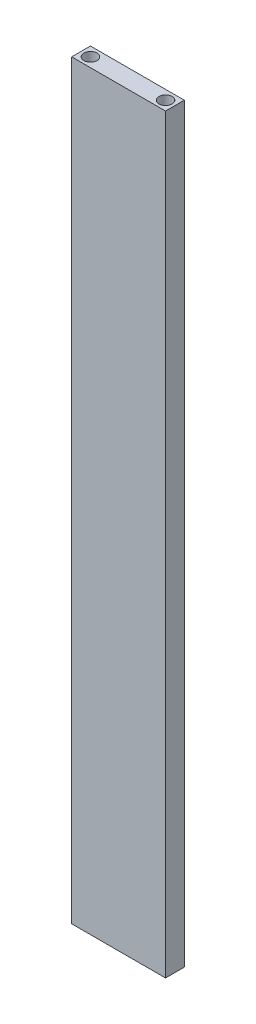
ISO-10303-21;
HEADER;
FILE_DESCRIPTION(('STEP AP214'),'2;1');
FILE_NAME('part.step','',(''),(''),'','','');
FILE_SCHEMA(('AUTOMOTIVE_DESIGN { 1 0 10303 214 1 1 1 1 }'));
ENDSEC;
DATA;
#1=APPLICATION_CONTEXT('core data for automotive mechanical design processes');
#2=APPLICATION_PROTOCOL_DEFINITION('international standard','automotive_design',2000,#1);
#3=PRODUCT_CONTEXT('',#1,'mechanical');
#4=PRODUCT('Part','Part','',(#3));
#5=PRODUCT_RELATED_PRODUCT_CATEGORY('part','',(#4));
#6=PRODUCT_DEFINITION_FORMATION('','',#4);
#7=PRODUCT_DEFINITION_CONTEXT('part definition',#1,'design');
#8=PRODUCT_DEFINITION('design','',#6,#7);
#9=PRODUCT_DEFINITION_SHAPE('','',#8);
#10=(LENGTH_UNIT() NAMED_UNIT(*) SI_UNIT(.MILLI.,.METRE.));
#11=(NAMED_UNIT(*) PLANE_ANGLE_UNIT() SI_UNIT($,.RADIAN.));
#12=(NAMED_UNIT(*) SI_UNIT($,.STERADIAN.) SOLID_ANGLE_UNIT());
#13=UNCERTAINTY_MEASURE_WITH_UNIT(LENGTH_MEASURE(1.E-05),#10,'distance_accuracy_value','');
#14=(GEOMETRIC_REPRESENTATION_CONTEXT(3) GLOBAL_UNCERTAINTY_ASSIGNED_CONTEXT((#13)) GLOBAL_UNIT_ASSIGNED_CONTEXT((#10,
#11,#12)) REPRESENTATION_CONTEXT('',''));
#15=CARTESIAN_POINT('',(0.,0.,0.));
#16=DIRECTION('',(0.,0.,1.));
#17=DIRECTION('',(1.,0.,0.));
#18=AXIS2_PLACEMENT_3D('',#15,#16,#17);
#19=CARTESIAN_POINT('',(0.,160.,0.));
#20=DIRECTION('',(-1.,0.,0.));
#21=DIRECTION('',(0.,0.,1.));
#22=AXIS2_PLACEMENT_3D('',#19,#20,#21);
#23=PLANE('',#22);
#24=DIRECTION('',(0.,0.,-1.));
#25=VECTOR('',#24,1.);
#26=CARTESIAN_POINT('',(0.,0.,0.));
#27=LINE('',#26,#25);
#28=CARTESIAN_POINT('',(0.,0.,4.));
#29=VERTEX_POINT('',#28);
#30=CARTESIAN_POINT('',(0.,0.,0.));
#31=VERTEX_POINT('',#30);
#32=EDGE_CURVE('E96',#29,#31,#27,.T.);
#33=ORIENTED_EDGE('',*,*,#32,.T.);
#34=DIRECTION('',(0.,-1.,0.));
#35=VECTOR('',#34,1.);
#36=CARTESIAN_POINT('',(0.,160.,0.));
#37=LINE('',#36,#35);
#38=CARTESIAN_POINT('',(0.,160.,0.));
#39=VERTEX_POINT('',#38);
#40=EDGE_CURVE('E11',#39,#31,#37,.T.);
#41=ORIENTED_EDGE('',*,*,#40,.F.);
#42=DIRECTION('',(0.,0.,-1.));
#43=VECTOR('',#42,1.);
#44=CARTESIAN_POINT('',(0.,160.,0.));
#45=LINE('',#44,#43);
#46=CARTESIAN_POINT('',(0.,160.,4.));
#47=VERTEX_POINT('',#46);
#48=EDGE_CURVE('E84',#47,#39,#45,.T.);
#49=ORIENTED_EDGE('',*,*,#48,.F.);
#50=DIRECTION('',(0.,-1.,0.));
#51=VECTOR('',#50,1.);
#52=CARTESIAN_POINT('',(0.,160.,4.));
#53=LINE('',#52,#51);
#54=EDGE_CURVE('E92',#47,#29,#53,.T.);
#55=ORIENTED_EDGE('',*,*,#54,.T.);
#56=EDGE_LOOP('',(#33,#41,#49,#55));
#57=FACE_BOUND('',#56,.T.);
#58=ADVANCED_FACE('F33',(#57),#23,.F.);
#59=CARTESIAN_POINT('',(0.,160.,0.));
#60=DIRECTION('',(0.,0.,1.));
#61=DIRECTION('',(1.,0.,0.));
#62=AXIS2_PLACEMENT_3D('',#59,#60,#61);
#63=PLANE('',#62);
#64=DIRECTION('',(-1.,0.,0.));
#65=VECTOR('',#64,1.);
#66=CARTESIAN_POINT('',(0.,0.,0.));
#67=LINE('',#66,#65);
#68=CARTESIAN_POINT('',(-20.,0.,0.));
#69=VERTEX_POINT('',#68);
#70=EDGE_CURVE('E88',#31,#69,#67,.T.);
#71=ORIENTED_EDGE('',*,*,#70,.T.);
#72=DIRECTION('',(0.,-1.,0.));
#73=VECTOR('',#72,1.);
#74=CARTESIAN_POINT('',(-20.,160.,0.));
#75=LINE('',#74,#73);
#76=CARTESIAN_POINT('',(-20.,160.,0.));
#77=VERTEX_POINT('',#76);
#78=EDGE_CURVE('E41',#77,#69,#75,.T.);
#79=ORIENTED_EDGE('',*,*,#78,.F.);
#80=DIRECTION('',(-1.,0.,0.));
#81=VECTOR('',#80,1.);
#82=CARTESIAN_POINT('',(0.,160.,0.));
#83=LINE('',#82,#81);
#84=EDGE_CURVE('E79',#39,#77,#83,.T.);
#85=ORIENTED_EDGE('',*,*,#84,.F.);
#86=ORIENTED_EDGE('',*,*,#40,.T.);
#87=EDGE_LOOP('',(#71,#79,#85,#86));
#88=FACE_BOUND('',#87,.T.);
#89=ADVANCED_FACE('F87',(#88),#63,.F.);
#90=CARTESIAN_POINT('',(-20.,160.,0.));
#91=DIRECTION('',(1.,0.,0.));
#92=DIRECTION('',(0.,0.,-1.));
#93=AXIS2_PLACEMENT_3D('',#90,#91,#92);
#94=PLANE('',#93);
#95=DIRECTION('',(0.,0.,1.));
#96=VECTOR('',#95,1.);
#97=CARTESIAN_POINT('',(-20.,0.,0.));
#98=LINE('',#97,#96);
#99=CARTESIAN_POINT('',(-20.,0.,4.));
#100=VERTEX_POINT('',#99);
#101=EDGE_CURVE('E66',#69,#100,#98,.T.);
#102=ORIENTED_EDGE('',*,*,#101,.T.);
#103=DIRECTION('',(0.,-1.,0.));
#104=VECTOR('',#103,1.);
#105=CARTESIAN_POINT('',(-20.,160.,4.));
#106=LINE('',#105,#104);
#107=CARTESIAN_POINT('',(-20.,160.,4.));
#108=VERTEX_POINT('',#107);
#109=EDGE_CURVE('E89',#108,#100,#106,.T.);
#110=ORIENTED_EDGE('',*,*,#109,.F.);
#111=DIRECTION('',(0.,0.,1.));
#112=VECTOR('',#111,1.);
#113=CARTESIAN_POINT('',(-20.,160.,0.));
#114=LINE('',#113,#112);
#115=EDGE_CURVE('E82',#77,#108,#114,.T.);
#116=ORIENTED_EDGE('',*,*,#115,.F.);
#117=ORIENTED_EDGE('',*,*,#78,.T.);
#118=EDGE_LOOP('',(#102,#110,#116,#117));
#119=FACE_BOUND('',#118,.T.);
#120=ADVANCED_FACE('F90',(#119),#94,.F.);
#121=CARTESIAN_POINT('',(0.,160.,4.));
#122=DIRECTION('',(0.,0.,-1.));
#123=DIRECTION('',(-1.,0.,0.));
#124=AXIS2_PLACEMENT_3D('',#121,#122,#123);
#125=PLANE('',#124);
#126=DIRECTION('',(1.,0.,0.));
#127=VECTOR('',#126,1.);
#128=CARTESIAN_POINT('',(0.,0.,4.));
#129=LINE('',#128,#127);
#130=EDGE_CURVE('E72',#100,#29,#129,.T.);
#131=ORIENTED_EDGE('',*,*,#130,.T.);
#132=ORIENTED_EDGE('',*,*,#54,.F.);
#133=DIRECTION('',(1.,0.,0.));
#134=VECTOR('',#133,1.);
#135=CARTESIAN_POINT('',(0.,160.,4.));
#136=LINE('',#135,#134);
#137=EDGE_CURVE('E49',#108,#47,#136,.T.);
#138=ORIENTED_EDGE('',*,*,#137,.F.);
#139=ORIENTED_EDGE('',*,*,#109,.T.);
#140=EDGE_LOOP('',(#131,#132,#138,#139));
#141=FACE_BOUND('',#140,.T.);
#142=ADVANCED_FACE('F104',(#141),#125,.F.);
#143=CARTESIAN_POINT('',(0.,160.,0.));
#144=DIRECTION('',(0.,-1.,0.));
#145=DIRECTION('',(0.,0.,-1.));
#146=AXIS2_PLACEMENT_3D('',#143,#144,#145);
#147=PLANE('',#146);
#148=CARTESIAN_POINT('',(-18.,160.,2.));
#149=DIRECTION('',(0.,-1.,0.));
#150=DIRECTION('',(0.,0.,-1.));
#151=AXIS2_PLACEMENT_3D('',#148,#149,#150);
#152=CIRCLE('',#151,1.4);
#153=CARTESIAN_POINT('',(-18.,160.,0.600000000000001));
#154=VERTEX_POINT('',#153);
#155=EDGE_CURVE('E99',#154,#154,#152,.F.);
#156=ORIENTED_EDGE('',*,*,#155,.F.);
#157=EDGE_LOOP('',(#156));
#158=FACE_BOUND('',#157,.T.);
#159=CARTESIAN_POINT('',(-2.,160.,2.));
#160=DIRECTION('',(0.,-1.,0.));
#161=DIRECTION('',(0.,0.,-1.));
#162=AXIS2_PLACEMENT_3D('',#159,#160,#161);
#163=CIRCLE('',#162,1.4);
#164=CARTESIAN_POINT('',(-2.,160.,0.600000000000002));
#165=VERTEX_POINT('',#164);
#166=EDGE_CURVE('E110',#165,#165,#163,.F.);
#167=ORIENTED_EDGE('',*,*,#166,.F.);
#168=EDGE_LOOP('',(#167));
#169=FACE_BOUND('',#168,.T.);
#170=ORIENTED_EDGE('',*,*,#48,.T.);
#171=ORIENTED_EDGE('',*,*,#84,.T.);
#172=ORIENTED_EDGE('',*,*,#115,.T.);
#173=ORIENTED_EDGE('',*,*,#137,.T.);
#174=EDGE_LOOP('',(#170,#171,#172,#173));
#175=FACE_BOUND('',#174,.T.);
#176=ADVANCED_FACE('F80',(#158,#169,#175),#147,.F.);
#177=CARTESIAN_POINT('',(0.,0.,0.));
#178=DIRECTION('',(0.,-1.,0.));
#179=DIRECTION('',(0.,0.,-1.));
#180=AXIS2_PLACEMENT_3D('',#177,#178,#179);
#181=PLANE('',#180);
#182=CARTESIAN_POINT('',(-18.,0.,2.));
#183=DIRECTION('',(0.,-1.,0.));
#184=DIRECTION('',(0.,0.,-1.));
#185=AXIS2_PLACEMENT_3D('',#182,#183,#184);
#186=CIRCLE('',#185,1.4);
#187=CARTESIAN_POINT('',(-18.,0.,0.600000000000001));
#188=VERTEX_POINT('',#187);
#189=EDGE_CURVE('E113',#188,#188,#186,.T.);
#190=ORIENTED_EDGE('',*,*,#189,.F.);
#191=EDGE_LOOP('',(#190));
#192=FACE_BOUND('',#191,.T.);
#193=CARTESIAN_POINT('',(-2.,0.,2.));
#194=DIRECTION('',(0.,-1.,0.));
#195=DIRECTION('',(0.,0.,-1.));
#196=AXIS2_PLACEMENT_3D('',#193,#194,#195);
#197=CIRCLE('',#196,1.4);
#198=CARTESIAN_POINT('',(-2.,0.,0.600000000000002));
#199=VERTEX_POINT('',#198);
#200=EDGE_CURVE('E114',#199,#199,#197,.T.);
#201=ORIENTED_EDGE('',*,*,#200,.F.);
#202=EDGE_LOOP('',(#201));
#203=FACE_BOUND('',#202,.T.);
#204=ORIENTED_EDGE('',*,*,#32,.F.);
#205=ORIENTED_EDGE('',*,*,#130,.F.);
#206=ORIENTED_EDGE('',*,*,#101,.F.);
#207=ORIENTED_EDGE('',*,*,#70,.F.);
#208=EDGE_LOOP('',(#204,#205,#206,#207));
#209=FACE_BOUND('',#208,.T.);
#210=ADVANCED_FACE('F107',(#192,#203,#209),#181,.T.);
#211=CARTESIAN_POINT('',(-2.,160.001,2.));
#212=DIRECTION('',(0.,-1.,0.));
#213=DIRECTION('',(0.,0.,-1.));
#214=AXIS2_PLACEMENT_3D('',#211,#212,#213);
#215=CYLINDRICAL_SURFACE('',#214,1.4);
#216=ORIENTED_EDGE('',*,*,#200,.T.);
#217=EDGE_LOOP('',(#216));
#218=FACE_BOUND('',#217,.T.);
#219=ORIENTED_EDGE('',*,*,#166,.T.);
#220=EDGE_LOOP('',(#219));
#221=FACE_BOUND('',#220,.T.);
#222=ADVANCED_FACE('F127',(#218,#221),#215,.F.);
#223=CARTESIAN_POINT('',(-18.,160.001,2.));
#224=DIRECTION('',(0.,-1.,0.));
#225=DIRECTION('',(0.,0.,-1.));
#226=AXIS2_PLACEMENT_3D('',#223,#224,#225);
#227=CYLINDRICAL_SURFACE('',#226,1.4);
#228=ORIENTED_EDGE('',*,*,#189,.T.);
#229=EDGE_LOOP('',(#228));
#230=FACE_BOUND('',#229,.T.);
#231=ORIENTED_EDGE('',*,*,#155,.T.);
#232=EDGE_LOOP('',(#231));
#233=FACE_BOUND('',#232,.T.);
#234=ADVANCED_FACE('F122',(#230,#233),#227,.F.);
#235=CLOSED_SHELL('',(#58,#89,#120,#142,#176,#210,#222,#234));
#236=MANIFOLD_SOLID_BREP('B2',#235);
#237=ADVANCED_BREP_SHAPE_REPRESENTATION('',(#18,#236),#14);
#238=SHAPE_DEFINITION_REPRESENTATION(#9,#237);
ENDSEC;
END-ISO-10303-21;
